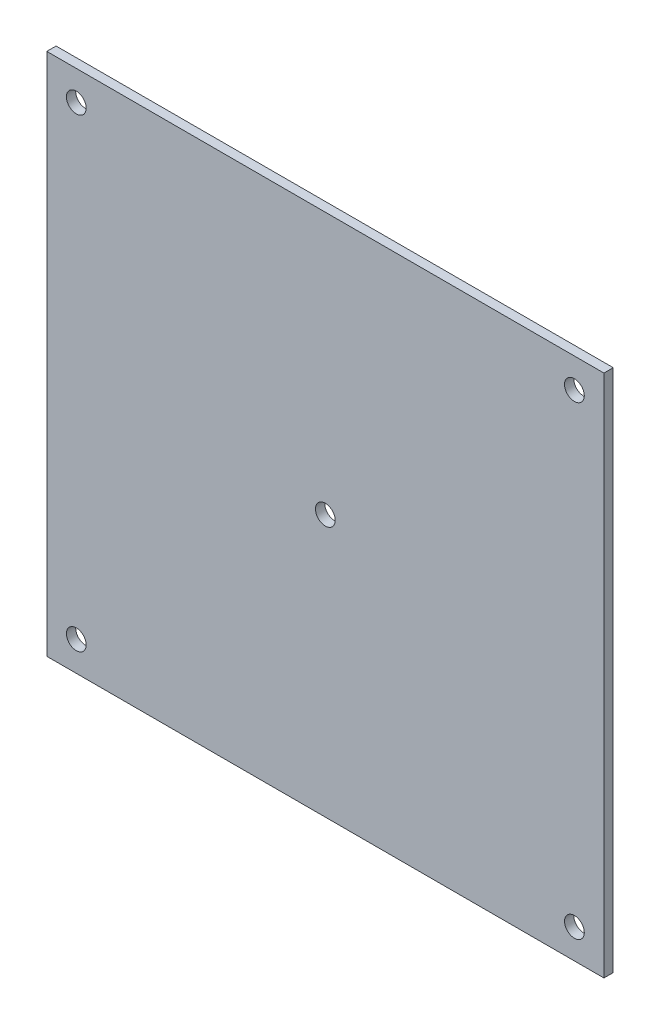
ISO-10303-21;
HEADER;
FILE_DESCRIPTION(('STEP AP214'),'2;1');
FILE_NAME('part.step','',(''),(''),'','','');
FILE_SCHEMA(('AUTOMOTIVE_DESIGN { 1 0 10303 214 1 1 1 1 }'));
ENDSEC;
DATA;
#1=APPLICATION_CONTEXT('core data for automotive mechanical design processes');
#2=APPLICATION_PROTOCOL_DEFINITION('international standard','automotive_design',2000,#1);
#3=PRODUCT_CONTEXT('',#1,'mechanical');
#4=PRODUCT('Part','Part','',(#3));
#5=PRODUCT_RELATED_PRODUCT_CATEGORY('part','',(#4));
#6=PRODUCT_DEFINITION_FORMATION('','',#4);
#7=PRODUCT_DEFINITION_CONTEXT('part definition',#1,'design');
#8=PRODUCT_DEFINITION('design','',#6,#7);
#9=PRODUCT_DEFINITION_SHAPE('','',#8);
#10=(LENGTH_UNIT() NAMED_UNIT(*) SI_UNIT(.MILLI.,.METRE.));
#11=(NAMED_UNIT(*) PLANE_ANGLE_UNIT() SI_UNIT($,.RADIAN.));
#12=(NAMED_UNIT(*) SI_UNIT($,.STERADIAN.) SOLID_ANGLE_UNIT());
#13=UNCERTAINTY_MEASURE_WITH_UNIT(LENGTH_MEASURE(1.E-05),#10,'distance_accuracy_value','');
#14=(GEOMETRIC_REPRESENTATION_CONTEXT(3) GLOBAL_UNCERTAINTY_ASSIGNED_CONTEXT((#13)) GLOBAL_UNIT_ASSIGNED_CONTEXT((#10,
#11,#12)) REPRESENTATION_CONTEXT('',''));
#15=CARTESIAN_POINT('',(0.,0.,0.));
#16=DIRECTION('',(0.,0.,1.));
#17=DIRECTION('',(1.,0.,0.));
#18=AXIS2_PLACEMENT_3D('',#15,#16,#17);
#19=CARTESIAN_POINT('',(0.,0.,1.6));
#20=DIRECTION('',(1.,0.,0.));
#21=DIRECTION('',(0.,0.,-1.));
#22=AXIS2_PLACEMENT_3D('',#19,#20,#21);
#23=PLANE('',#22);
#24=DIRECTION('',(0.,-1.,0.));
#25=VECTOR('',#24,1.);
#26=CARTESIAN_POINT('',(0.,0.,0.));
#27=LINE('',#26,#25);
#28=CARTESIAN_POINT('',(0.,90.17,0.));
#29=VERTEX_POINT('',#28);
#30=CARTESIAN_POINT('',(0.,0.,0.));
#31=VERTEX_POINT('',#30);
#32=EDGE_CURVE('E106',#29,#31,#27,.T.);
#33=ORIENTED_EDGE('',*,*,#32,.T.);
#34=DIRECTION('',(0.,0.,-1.));
#35=VECTOR('',#34,1.);
#36=CARTESIAN_POINT('',(0.,0.,1.6));
#37=LINE('',#36,#35);
#38=CARTESIAN_POINT('',(0.,0.,1.6));
#39=VERTEX_POINT('',#38);
#40=EDGE_CURVE('E11',#39,#31,#37,.T.);
#41=ORIENTED_EDGE('',*,*,#40,.F.);
#42=DIRECTION('',(0.,-1.,0.));
#43=VECTOR('',#42,1.);
#44=CARTESIAN_POINT('',(0.,0.,1.6));
#45=LINE('',#44,#43);
#46=CARTESIAN_POINT('',(0.,90.17,1.6));
#47=VERTEX_POINT('',#46);
#48=EDGE_CURVE('E93',#47,#39,#45,.T.);
#49=ORIENTED_EDGE('',*,*,#48,.F.);
#50=DIRECTION('',(0.,0.,-1.));
#51=VECTOR('',#50,1.);
#52=CARTESIAN_POINT('',(0.,90.17,1.6));
#53=LINE('',#52,#51);
#54=EDGE_CURVE('E102',#47,#29,#53,.T.);
#55=ORIENTED_EDGE('',*,*,#54,.T.);
#56=EDGE_LOOP('',(#33,#41,#49,#55));
#57=FACE_BOUND('',#56,.T.);
#58=ADVANCED_FACE('F40',(#57),#23,.F.);
#59=CARTESIAN_POINT('',(0.,0.,1.6));
#60=DIRECTION('',(0.,1.,0.));
#61=DIRECTION('',(0.,0.,1.));
#62=AXIS2_PLACEMENT_3D('',#59,#60,#61);
#63=PLANE('',#62);
#64=DIRECTION('',(1.,0.,0.));
#65=VECTOR('',#64,1.);
#66=CARTESIAN_POINT('',(0.,0.,0.));
#67=LINE('',#66,#65);
#68=CARTESIAN_POINT('',(95.89,0.,0.));
#69=VERTEX_POINT('',#68);
#70=EDGE_CURVE('E97',#31,#69,#67,.T.);
#71=ORIENTED_EDGE('',*,*,#70,.T.);
#72=DIRECTION('',(0.,0.,-1.));
#73=VECTOR('',#72,1.);
#74=CARTESIAN_POINT('',(95.89,0.,1.6));
#75=LINE('',#74,#73);
#76=CARTESIAN_POINT('',(95.89,0.,1.6));
#77=VERTEX_POINT('',#76);
#78=EDGE_CURVE('E49',#77,#69,#75,.T.);
#79=ORIENTED_EDGE('',*,*,#78,.F.);
#80=DIRECTION('',(1.,0.,0.));
#81=VECTOR('',#80,1.);
#82=CARTESIAN_POINT('',(0.,0.,1.6));
#83=LINE('',#82,#81);
#84=EDGE_CURVE('E88',#39,#77,#83,.T.);
#85=ORIENTED_EDGE('',*,*,#84,.F.);
#86=ORIENTED_EDGE('',*,*,#40,.T.);
#87=EDGE_LOOP('',(#71,#79,#85,#86));
#88=FACE_BOUND('',#87,.T.);
#89=ADVANCED_FACE('F96',(#88),#63,.F.);
#90=CARTESIAN_POINT('',(95.89,0.,1.6));
#91=DIRECTION('',(-1.,0.,0.));
#92=DIRECTION('',(0.,0.,1.));
#93=AXIS2_PLACEMENT_3D('',#90,#91,#92);
#94=PLANE('',#93);
#95=DIRECTION('',(0.,1.,0.));
#96=VECTOR('',#95,1.);
#97=CARTESIAN_POINT('',(95.89,0.,0.));
#98=LINE('',#97,#96);
#99=CARTESIAN_POINT('',(95.89,90.17,0.));
#100=VERTEX_POINT('',#99);
#101=EDGE_CURVE('E75',#69,#100,#98,.T.);
#102=ORIENTED_EDGE('',*,*,#101,.T.);
#103=DIRECTION('',(0.,0.,-1.));
#104=VECTOR('',#103,1.);
#105=CARTESIAN_POINT('',(95.89,90.17,1.6));
#106=LINE('',#105,#104);
#107=CARTESIAN_POINT('',(95.89,90.17,1.6));
#108=VERTEX_POINT('',#107);
#109=EDGE_CURVE('E98',#108,#100,#106,.T.);
#110=ORIENTED_EDGE('',*,*,#109,.F.);
#111=DIRECTION('',(0.,1.,0.));
#112=VECTOR('',#111,1.);
#113=CARTESIAN_POINT('',(95.89,0.,1.6));
#114=LINE('',#113,#112);
#115=EDGE_CURVE('E91',#77,#108,#114,.T.);
#116=ORIENTED_EDGE('',*,*,#115,.F.);
#117=ORIENTED_EDGE('',*,*,#78,.T.);
#118=EDGE_LOOP('',(#102,#110,#116,#117));
#119=FACE_BOUND('',#118,.T.);
#120=ADVANCED_FACE('F100',(#119),#94,.F.);
#121=CARTESIAN_POINT('',(0.,90.17,1.6));
#122=DIRECTION('',(0.,-1.,0.));
#123=DIRECTION('',(0.,0.,-1.));
#124=AXIS2_PLACEMENT_3D('',#121,#122,#123);
#125=PLANE('',#124);
#126=DIRECTION('',(-1.,0.,0.));
#127=VECTOR('',#126,1.);
#128=CARTESIAN_POINT('',(0.,90.17,0.));
#129=LINE('',#128,#127);
#130=EDGE_CURVE('E81',#100,#29,#129,.T.);
#131=ORIENTED_EDGE('',*,*,#130,.T.);
#132=ORIENTED_EDGE('',*,*,#54,.F.);
#133=DIRECTION('',(-1.,0.,0.));
#134=VECTOR('',#133,1.);
#135=CARTESIAN_POINT('',(0.,90.17,1.6));
#136=LINE('',#135,#134);
#137=EDGE_CURVE('E58',#108,#47,#136,.T.);
#138=ORIENTED_EDGE('',*,*,#137,.F.);
#139=ORIENTED_EDGE('',*,*,#109,.T.);
#140=EDGE_LOOP('',(#131,#132,#138,#139));
#141=FACE_BOUND('',#140,.T.);
#142=ADVANCED_FACE('F147',(#141),#125,.F.);
#143=CARTESIAN_POINT('',(0.,0.,1.6));
#144=DIRECTION('',(0.,0.,-1.));
#145=DIRECTION('',(-1.,0.,0.));
#146=AXIS2_PLACEMENT_3D('',#143,#144,#145);
#147=PLANE('',#146);
#148=CARTESIAN_POINT('',(90.81,5.08,1.6));
#149=DIRECTION('',(0.,0.,1.));
#150=DIRECTION('',(1.,0.,0.));
#151=AXIS2_PLACEMENT_3D('',#148,#149,#150);
#152=CIRCLE('',#151,1.69999999999999);
#153=CARTESIAN_POINT('',(92.51,5.08,1.6));
#154=VERTEX_POINT('',#153);
#155=EDGE_CURVE('E239',#154,#154,#152,.T.);
#156=ORIENTED_EDGE('',*,*,#155,.F.);
#157=EDGE_LOOP('',(#156));
#158=FACE_BOUND('',#157,.T.);
#159=CARTESIAN_POINT('',(5.08,85.09,1.6));
#160=DIRECTION('',(0.,0.,1.));
#161=DIRECTION('',(1.,0.,0.));
#162=AXIS2_PLACEMENT_3D('',#159,#160,#161);
#163=CIRCLE('',#162,1.7);
#164=CARTESIAN_POINT('',(6.78,85.09,1.6));
#165=VERTEX_POINT('',#164);
#166=EDGE_CURVE('E237',#165,#165,#163,.T.);
#167=ORIENTED_EDGE('',*,*,#166,.F.);
#168=EDGE_LOOP('',(#167));
#169=FACE_BOUND('',#168,.T.);
#170=CARTESIAN_POINT('',(90.81,85.09,1.6));
#171=DIRECTION('',(0.,0.,1.));
#172=DIRECTION('',(1.,0.,0.));
#173=AXIS2_PLACEMENT_3D('',#170,#171,#172);
#174=CIRCLE('',#173,1.69999999999999);
#175=CARTESIAN_POINT('',(92.51,85.09,1.6));
#176=VERTEX_POINT('',#175);
#177=EDGE_CURVE('E240',#176,#176,#174,.T.);
#178=ORIENTED_EDGE('',*,*,#177,.F.);
#179=EDGE_LOOP('',(#178));
#180=FACE_BOUND('',#179,.T.);
#181=CARTESIAN_POINT('',(47.945,45.085,1.6));
#182=DIRECTION('',(0.,0.,1.));
#183=DIRECTION('',(1.,0.,0.));
#184=AXIS2_PLACEMENT_3D('',#181,#182,#183);
#185=CIRCLE('',#184,1.7);
#186=CARTESIAN_POINT('',(49.645,45.085,1.6));
#187=VERTEX_POINT('',#186);
#188=EDGE_CURVE('E245',#187,#187,#185,.T.);
#189=ORIENTED_EDGE('',*,*,#188,.F.);
#190=EDGE_LOOP('',(#189));
#191=FACE_BOUND('',#190,.T.);
#192=CARTESIAN_POINT('',(5.08,5.08,1.6));
#193=DIRECTION('',(0.,0.,1.));
#194=DIRECTION('',(1.,0.,0.));
#195=AXIS2_PLACEMENT_3D('',#192,#193,#194);
#196=CIRCLE('',#195,1.7);
#197=CARTESIAN_POINT('',(6.78,5.08,1.6));
#198=VERTEX_POINT('',#197);
#199=EDGE_CURVE('E118',#198,#198,#196,.T.);
#200=ORIENTED_EDGE('',*,*,#199,.F.);
#201=EDGE_LOOP('',(#200));
#202=FACE_BOUND('',#201,.T.);
#203=ORIENTED_EDGE('',*,*,#48,.T.);
#204=ORIENTED_EDGE('',*,*,#84,.T.);
#205=ORIENTED_EDGE('',*,*,#115,.T.);
#206=ORIENTED_EDGE('',*,*,#137,.T.);
#207=EDGE_LOOP('',(#203,#204,#205,#206));
#208=FACE_BOUND('',#207,.T.);
#209=ADVANCED_FACE('F89',(#158,#169,#180,#191,#202,#208),#147,.F.);
#210=CARTESIAN_POINT('',(0.,0.,0.));
#211=DIRECTION('',(0.,0.,-1.));
#212=DIRECTION('',(-1.,0.,0.));
#213=AXIS2_PLACEMENT_3D('',#210,#211,#212);
#214=PLANE('',#213);
#215=CARTESIAN_POINT('',(90.81,5.08,0.));
#216=DIRECTION('',(0.,0.,-1.));
#217=DIRECTION('',(-1.,0.,0.));
#218=AXIS2_PLACEMENT_3D('',#215,#216,#217);
#219=CIRCLE('',#218,1.69999999999999);
#220=CARTESIAN_POINT('',(92.51,5.08,0.));
#221=VERTEX_POINT('',#220);
#222=EDGE_CURVE('E43',#221,#221,#219,.T.);
#223=ORIENTED_EDGE('',*,*,#222,.F.);
#224=EDGE_LOOP('',(#223));
#225=FACE_BOUND('',#224,.T.);
#226=CARTESIAN_POINT('',(5.08,85.09,0.));
#227=DIRECTION('',(0.,0.,-1.));
#228=DIRECTION('',(-1.,0.,0.));
#229=AXIS2_PLACEMENT_3D('',#226,#227,#228);
#230=CIRCLE('',#229,1.7);
#231=CARTESIAN_POINT('',(6.78,85.09,0.));
#232=VERTEX_POINT('',#231);
#233=EDGE_CURVE('E123',#232,#232,#230,.T.);
#234=ORIENTED_EDGE('',*,*,#233,.F.);
#235=EDGE_LOOP('',(#234));
#236=FACE_BOUND('',#235,.T.);
#237=CARTESIAN_POINT('',(90.81,85.09,0.));
#238=DIRECTION('',(0.,0.,-1.));
#239=DIRECTION('',(-1.,0.,0.));
#240=AXIS2_PLACEMENT_3D('',#237,#238,#239);
#241=CIRCLE('',#240,1.69999999999999);
#242=CARTESIAN_POINT('',(92.51,85.09,0.));
#243=VERTEX_POINT('',#242);
#244=EDGE_CURVE('E121',#243,#243,#241,.T.);
#245=ORIENTED_EDGE('',*,*,#244,.F.);
#246=EDGE_LOOP('',(#245));
#247=FACE_BOUND('',#246,.T.);
#248=CARTESIAN_POINT('',(47.945,45.085,0.));
#249=DIRECTION('',(0.,0.,-1.));
#250=DIRECTION('',(-1.,0.,0.));
#251=AXIS2_PLACEMENT_3D('',#248,#249,#250);
#252=CIRCLE('',#251,1.7);
#253=CARTESIAN_POINT('',(49.645,45.085,0.));
#254=VERTEX_POINT('',#253);
#255=EDGE_CURVE('E117',#254,#254,#252,.T.);
#256=ORIENTED_EDGE('',*,*,#255,.F.);
#257=EDGE_LOOP('',(#256));
#258=FACE_BOUND('',#257,.T.);
#259=CARTESIAN_POINT('',(5.08,5.08,0.));
#260=DIRECTION('',(0.,0.,-1.));
#261=DIRECTION('',(-1.,0.,0.));
#262=AXIS2_PLACEMENT_3D('',#259,#260,#261);
#263=CIRCLE('',#262,1.7);
#264=CARTESIAN_POINT('',(6.78,5.08,0.));
#265=VERTEX_POINT('',#264);
#266=EDGE_CURVE('E114',#265,#265,#263,.T.);
#267=ORIENTED_EDGE('',*,*,#266,.F.);
#268=EDGE_LOOP('',(#267));
#269=FACE_BOUND('',#268,.T.);
#270=ORIENTED_EDGE('',*,*,#32,.F.);
#271=ORIENTED_EDGE('',*,*,#130,.F.);
#272=ORIENTED_EDGE('',*,*,#101,.F.);
#273=ORIENTED_EDGE('',*,*,#70,.F.);
#274=EDGE_LOOP('',(#270,#271,#272,#273));
#275=FACE_BOUND('',#274,.T.);
#276=ADVANCED_FACE('F133',(#225,#236,#247,#258,#269,#275),#214,.T.);
#277=CARTESIAN_POINT('',(5.08,5.08,-1.2E-05));
#278=DIRECTION('',(0.,0.,1.));
#279=DIRECTION('',(1.,0.,0.));
#280=AXIS2_PLACEMENT_3D('',#277,#278,#279);
#281=CYLINDRICAL_SURFACE('',#280,1.7);
#282=CARTESIAN_POINT('',(6.78,5.08,0.));
#283=CARTESIAN_POINT('',(6.78,5.08,0.0166666666666667));
#284=CARTESIAN_POINT('',(6.78,5.08,0.0333333333333333));
#285=CARTESIAN_POINT('',(6.78,5.08,0.0666666666666667));
#286=CARTESIAN_POINT('',(6.78,5.08,0.0833333333333333));
#287=CARTESIAN_POINT('',(6.78,5.08,0.116666666666667));
#288=CARTESIAN_POINT('',(6.78,5.08,0.133333333333333));
#289=CARTESIAN_POINT('',(6.78,5.08,0.166666666666667));
#290=CARTESIAN_POINT('',(6.78,5.08,0.183333333333333));
#291=CARTESIAN_POINT('',(6.78,5.08,0.216666666666667));
#292=CARTESIAN_POINT('',(6.78,5.08,0.233333333333333));
#293=CARTESIAN_POINT('',(6.78,5.08,0.266666666666667));
#294=CARTESIAN_POINT('',(6.78,5.08,0.283333333333333));
#295=CARTESIAN_POINT('',(6.78,5.08,0.316666666666667));
#296=CARTESIAN_POINT('',(6.78,5.08,0.333333333333333));
#297=CARTESIAN_POINT('',(6.78,5.08,0.366666666666667));
#298=CARTESIAN_POINT('',(6.78,5.08,0.383333333333333));
#299=CARTESIAN_POINT('',(6.78,5.08,0.416666666666667));
#300=CARTESIAN_POINT('',(6.78,5.08,0.433333333333333));
#301=CARTESIAN_POINT('',(6.78,5.08,0.466666666666667));
#302=CARTESIAN_POINT('',(6.78,5.08,0.483333333333333));
#303=CARTESIAN_POINT('',(6.78,5.08,0.516666666666667));
#304=CARTESIAN_POINT('',(6.78,5.08,0.533333333333333));
#305=CARTESIAN_POINT('',(6.78,5.08,0.566666666666667));
#306=CARTESIAN_POINT('',(6.78,5.08,0.583333333333333));
#307=CARTESIAN_POINT('',(6.78,5.08,0.616666666666667));
#308=CARTESIAN_POINT('',(6.78,5.08,0.633333333333333));
#309=CARTESIAN_POINT('',(6.78,5.08,0.666666666666667));
#310=CARTESIAN_POINT('',(6.78,5.08,0.683333333333333));
#311=CARTESIAN_POINT('',(6.78,5.08,0.716666666666667));
#312=CARTESIAN_POINT('',(6.78,5.08,0.733333333333333));
#313=CARTESIAN_POINT('',(6.78,5.08,0.766666666666667));
#314=CARTESIAN_POINT('',(6.78,5.08,0.783333333333333));
#315=CARTESIAN_POINT('',(6.78,5.08,0.816666666666667));
#316=CARTESIAN_POINT('',(6.78,5.08,0.833333333333333));
#317=CARTESIAN_POINT('',(6.78,5.08,0.866666666666667));
#318=CARTESIAN_POINT('',(6.78,5.08,0.883333333333333));
#319=CARTESIAN_POINT('',(6.78,5.08,0.916666666666667));
#320=CARTESIAN_POINT('',(6.78,5.08,0.933333333333333));
#321=CARTESIAN_POINT('',(6.78,5.08,0.966666666666667));
#322=CARTESIAN_POINT('',(6.78,5.08,0.983333333333333));
#323=CARTESIAN_POINT('',(6.78,5.08,1.01666666666667));
#324=CARTESIAN_POINT('',(6.78,5.08,1.03333333333333));
#325=CARTESIAN_POINT('',(6.78,5.08,1.06666666666667));
#326=CARTESIAN_POINT('',(6.78,5.08,1.08333333333333));
#327=CARTESIAN_POINT('',(6.78,5.08,1.11666666666667));
#328=CARTESIAN_POINT('',(6.78,5.08,1.13333333333333));
#329=CARTESIAN_POINT('',(6.78,5.08,1.16666666666667));
#330=CARTESIAN_POINT('',(6.78,5.08,1.18333333333333));
#331=CARTESIAN_POINT('',(6.78,5.08,1.21666666666667));
#332=CARTESIAN_POINT('',(6.78,5.08,1.23333333333333));
#333=CARTESIAN_POINT('',(6.78,5.08,1.26666666666667));
#334=CARTESIAN_POINT('',(6.78,5.08,1.28333333333333));
#335=CARTESIAN_POINT('',(6.78,5.08,1.31666666666667));
#336=CARTESIAN_POINT('',(6.78,5.08,1.33333333333333));
#337=CARTESIAN_POINT('',(6.78,5.08,1.36666666666667));
#338=CARTESIAN_POINT('',(6.78,5.08,1.38333333333333));
#339=CARTESIAN_POINT('',(6.78,5.08,1.41666666666667));
#340=CARTESIAN_POINT('',(6.78,5.08,1.43333333333333));
#341=CARTESIAN_POINT('',(6.78,5.08,1.46666666666667));
#342=CARTESIAN_POINT('',(6.78,5.08,1.48333333333333));
#343=CARTESIAN_POINT('',(6.78,5.08,1.51666666666667));
#344=CARTESIAN_POINT('',(6.78,5.08,1.53333333333333));
#345=CARTESIAN_POINT('',(6.78,5.08,1.56666666666667));
#346=CARTESIAN_POINT('',(6.78,5.08,1.58333333333333));
#347=CARTESIAN_POINT('',(6.78,5.08,1.6));
#348=B_SPLINE_CURVE_WITH_KNOTS('',3,(#282,#283,#284,#285,#286,#287,#288,#289,#290,#291,#292,
#293,#294,#295,#296,#297,#298,#299,#300,#301,#302,#303,#304,#305,#306,#307,#308,#309,#310,#311,
#312,#313,#314,#315,#316,#317,#318,#319,#320,#321,#322,#323,#324,#325,#326,#327,#328,#329,#330,
#331,#332,#333,#334,#335,#336,#337,#338,#339,#340,#341,#342,#343,#344,#345,#346,#347),
.UNSPECIFIED.,.F.,.F.,(4,2,2,2,2,2,2,2,2,2,2,2,2,2,2,2,2,2,2,2,2,2,2,2,2,2,2,2,2,2,2,2,4),(0.,
0.05,0.1,0.15,0.2,0.25,0.3,0.35,0.4,0.45,0.5,0.55,0.6,0.65,0.7,0.75,0.8,0.85,0.9,0.95,1.,1.05,
1.1,1.15,1.2,1.25,1.3,1.35,1.4,1.45,1.5,1.55,1.6),.UNSPECIFIED.);
#349=EDGE_CURVE('BSEAM136',#265,#198,#348,.T.);
#350=ORIENTED_EDGE('',*,*,#266,.T.);
#351=ORIENTED_EDGE('',*,*,#199,.T.);
#352=ORIENTED_EDGE('',*,*,#349,.T.);
#353=ORIENTED_EDGE('',*,*,#349,.F.);
#354=EDGE_LOOP('',(#350,#352,#351,#353));
#355=FACE_BOUND('',#354,.T.);
#356=ADVANCED_FACE('F136',(#355),#281,.F.);
#357=CARTESIAN_POINT('',(47.945,45.085,-1.2E-05));
#358=DIRECTION('',(0.,0.,1.));
#359=DIRECTION('',(1.,0.,0.));
#360=AXIS2_PLACEMENT_3D('',#357,#358,#359);
#361=CYLINDRICAL_SURFACE('',#360,1.7);
#362=CARTESIAN_POINT('',(49.645,45.085,0.));
#363=CARTESIAN_POINT('',(49.645,45.085,0.0166666666666667));
#364=CARTESIAN_POINT('',(49.645,45.085,0.0333333333333333));
#365=CARTESIAN_POINT('',(49.645,45.085,0.0666666666666667));
#366=CARTESIAN_POINT('',(49.645,45.085,0.0833333333333333));
#367=CARTESIAN_POINT('',(49.645,45.085,0.116666666666667));
#368=CARTESIAN_POINT('',(49.645,45.085,0.133333333333333));
#369=CARTESIAN_POINT('',(49.645,45.085,0.166666666666667));
#370=CARTESIAN_POINT('',(49.645,45.085,0.183333333333333));
#371=CARTESIAN_POINT('',(49.645,45.085,0.216666666666667));
#372=CARTESIAN_POINT('',(49.645,45.085,0.233333333333333));
#373=CARTESIAN_POINT('',(49.645,45.085,0.266666666666667));
#374=CARTESIAN_POINT('',(49.645,45.085,0.283333333333333));
#375=CARTESIAN_POINT('',(49.645,45.085,0.316666666666667));
#376=CARTESIAN_POINT('',(49.645,45.085,0.333333333333333));
#377=CARTESIAN_POINT('',(49.645,45.085,0.366666666666667));
#378=CARTESIAN_POINT('',(49.645,45.085,0.383333333333333));
#379=CARTESIAN_POINT('',(49.645,45.085,0.416666666666667));
#380=CARTESIAN_POINT('',(49.645,45.085,0.433333333333333));
#381=CARTESIAN_POINT('',(49.645,45.085,0.466666666666667));
#382=CARTESIAN_POINT('',(49.645,45.085,0.483333333333333));
#383=CARTESIAN_POINT('',(49.645,45.085,0.516666666666667));
#384=CARTESIAN_POINT('',(49.645,45.085,0.533333333333333));
#385=CARTESIAN_POINT('',(49.645,45.085,0.566666666666667));
#386=CARTESIAN_POINT('',(49.645,45.085,0.583333333333333));
#387=CARTESIAN_POINT('',(49.645,45.085,0.616666666666667));
#388=CARTESIAN_POINT('',(49.645,45.085,0.633333333333333));
#389=CARTESIAN_POINT('',(49.645,45.085,0.666666666666667));
#390=CARTESIAN_POINT('',(49.645,45.085,0.683333333333333));
#391=CARTESIAN_POINT('',(49.645,45.085,0.716666666666667));
#392=CARTESIAN_POINT('',(49.645,45.085,0.733333333333333));
#393=CARTESIAN_POINT('',(49.645,45.085,0.766666666666667));
#394=CARTESIAN_POINT('',(49.645,45.085,0.783333333333333));
#395=CARTESIAN_POINT('',(49.645,45.085,0.816666666666667));
#396=CARTESIAN_POINT('',(49.645,45.085,0.833333333333333));
#397=CARTESIAN_POINT('',(49.645,45.085,0.866666666666667));
#398=CARTESIAN_POINT('',(49.645,45.085,0.883333333333333));
#399=CARTESIAN_POINT('',(49.645,45.085,0.916666666666667));
#400=CARTESIAN_POINT('',(49.645,45.085,0.933333333333333));
#401=CARTESIAN_POINT('',(49.645,45.085,0.966666666666667));
#402=CARTESIAN_POINT('',(49.645,45.085,0.983333333333333));
#403=CARTESIAN_POINT('',(49.645,45.085,1.01666666666667));
#404=CARTESIAN_POINT('',(49.645,45.085,1.03333333333333));
#405=CARTESIAN_POINT('',(49.645,45.085,1.06666666666667));
#406=CARTESIAN_POINT('',(49.645,45.085,1.08333333333333));
#407=CARTESIAN_POINT('',(49.645,45.085,1.11666666666667));
#408=CARTESIAN_POINT('',(49.645,45.085,1.13333333333333));
#409=CARTESIAN_POINT('',(49.645,45.085,1.16666666666667));
#410=CARTESIAN_POINT('',(49.645,45.085,1.18333333333333));
#411=CARTESIAN_POINT('',(49.645,45.085,1.21666666666667));
#412=CARTESIAN_POINT('',(49.645,45.085,1.23333333333333));
#413=CARTESIAN_POINT('',(49.645,45.085,1.26666666666667));
#414=CARTESIAN_POINT('',(49.645,45.085,1.28333333333333));
#415=CARTESIAN_POINT('',(49.645,45.085,1.31666666666667));
#416=CARTESIAN_POINT('',(49.645,45.085,1.33333333333333));
#417=CARTESIAN_POINT('',(49.645,45.085,1.36666666666667));
#418=CARTESIAN_POINT('',(49.645,45.085,1.38333333333333));
#419=CARTESIAN_POINT('',(49.645,45.085,1.41666666666667));
#420=CARTESIAN_POINT('',(49.645,45.085,1.43333333333333));
#421=CARTESIAN_POINT('',(49.645,45.085,1.46666666666667));
#422=CARTESIAN_POINT('',(49.645,45.085,1.48333333333333));
#423=CARTESIAN_POINT('',(49.645,45.085,1.51666666666667));
#424=CARTESIAN_POINT('',(49.645,45.085,1.53333333333333));
#425=CARTESIAN_POINT('',(49.645,45.085,1.56666666666667));
#426=CARTESIAN_POINT('',(49.645,45.085,1.58333333333333));
#427=CARTESIAN_POINT('',(49.645,45.085,1.6));
#428=B_SPLINE_CURVE_WITH_KNOTS('',3,(#362,#363,#364,#365,#366,#367,#368,#369,#370,#371,#372,
#373,#374,#375,#376,#377,#378,#379,#380,#381,#382,#383,#384,#385,#386,#387,#388,#389,#390,#391,
#392,#393,#394,#395,#396,#397,#398,#399,#400,#401,#402,#403,#404,#405,#406,#407,#408,#409,#410,
#411,#412,#413,#414,#415,#416,#417,#418,#419,#420,#421,#422,#423,#424,#425,#426,#427),
.UNSPECIFIED.,.F.,.F.,(4,2,2,2,2,2,2,2,2,2,2,2,2,2,2,2,2,2,2,2,2,2,2,2,2,2,2,2,2,2,2,2,4),(0.,
0.05,0.1,0.15,0.2,0.25,0.3,0.35,0.4,0.45,0.5,0.55,0.6,0.65,0.7,0.75,0.8,0.85,0.9,0.95,1.,1.05,
1.1,1.15,1.2,1.25,1.3,1.35,1.4,1.45,1.5,1.55,1.6),.UNSPECIFIED.);
#429=EDGE_CURVE('BSEAM194',#254,#187,#428,.T.);
#430=ORIENTED_EDGE('',*,*,#255,.T.);
#431=ORIENTED_EDGE('',*,*,#188,.T.);
#432=ORIENTED_EDGE('',*,*,#429,.T.);
#433=ORIENTED_EDGE('',*,*,#429,.F.);
#434=EDGE_LOOP('',(#430,#432,#431,#433));
#435=FACE_BOUND('',#434,.T.);
#436=ADVANCED_FACE('F194',(#435),#361,.F.);
#437=CARTESIAN_POINT('',(90.81,85.09,-1.2E-05));
#438=DIRECTION('',(0.,0.,1.));
#439=DIRECTION('',(1.,0.,0.));
#440=AXIS2_PLACEMENT_3D('',#437,#438,#439);
#441=CYLINDRICAL_SURFACE('',#440,1.69999999999999);
#442=CARTESIAN_POINT('',(92.51,85.09,0.));
#443=CARTESIAN_POINT('',(92.51,85.09,0.0166666666666667));
#444=CARTESIAN_POINT('',(92.51,85.09,0.0333333333333333));
#445=CARTESIAN_POINT('',(92.51,85.09,0.0666666666666667));
#446=CARTESIAN_POINT('',(92.51,85.09,0.0833333333333333));
#447=CARTESIAN_POINT('',(92.51,85.09,0.116666666666667));
#448=CARTESIAN_POINT('',(92.51,85.09,0.133333333333333));
#449=CARTESIAN_POINT('',(92.51,85.09,0.166666666666667));
#450=CARTESIAN_POINT('',(92.51,85.09,0.183333333333333));
#451=CARTESIAN_POINT('',(92.51,85.09,0.216666666666667));
#452=CARTESIAN_POINT('',(92.51,85.09,0.233333333333333));
#453=CARTESIAN_POINT('',(92.51,85.09,0.266666666666667));
#454=CARTESIAN_POINT('',(92.51,85.09,0.283333333333333));
#455=CARTESIAN_POINT('',(92.51,85.09,0.316666666666667));
#456=CARTESIAN_POINT('',(92.51,85.09,0.333333333333333));
#457=CARTESIAN_POINT('',(92.51,85.09,0.366666666666667));
#458=CARTESIAN_POINT('',(92.51,85.09,0.383333333333333));
#459=CARTESIAN_POINT('',(92.51,85.09,0.416666666666667));
#460=CARTESIAN_POINT('',(92.51,85.09,0.433333333333333));
#461=CARTESIAN_POINT('',(92.51,85.09,0.466666666666667));
#462=CARTESIAN_POINT('',(92.51,85.09,0.483333333333333));
#463=CARTESIAN_POINT('',(92.51,85.09,0.516666666666667));
#464=CARTESIAN_POINT('',(92.51,85.09,0.533333333333333));
#465=CARTESIAN_POINT('',(92.51,85.09,0.566666666666667));
#466=CARTESIAN_POINT('',(92.51,85.09,0.583333333333333));
#467=CARTESIAN_POINT('',(92.51,85.09,0.616666666666667));
#468=CARTESIAN_POINT('',(92.51,85.09,0.633333333333333));
#469=CARTESIAN_POINT('',(92.51,85.09,0.666666666666667));
#470=CARTESIAN_POINT('',(92.51,85.09,0.683333333333333));
#471=CARTESIAN_POINT('',(92.51,85.09,0.716666666666667));
#472=CARTESIAN_POINT('',(92.51,85.09,0.733333333333333));
#473=CARTESIAN_POINT('',(92.51,85.09,0.766666666666667));
#474=CARTESIAN_POINT('',(92.51,85.09,0.783333333333333));
#475=CARTESIAN_POINT('',(92.51,85.09,0.816666666666667));
#476=CARTESIAN_POINT('',(92.51,85.09,0.833333333333333));
#477=CARTESIAN_POINT('',(92.51,85.09,0.866666666666667));
#478=CARTESIAN_POINT('',(92.51,85.09,0.883333333333333));
#479=CARTESIAN_POINT('',(92.51,85.09,0.916666666666667));
#480=CARTESIAN_POINT('',(92.51,85.09,0.933333333333333));
#481=CARTESIAN_POINT('',(92.51,85.09,0.966666666666667));
#482=CARTESIAN_POINT('',(92.51,85.09,0.983333333333333));
#483=CARTESIAN_POINT('',(92.51,85.09,1.01666666666667));
#484=CARTESIAN_POINT('',(92.51,85.09,1.03333333333333));
#485=CARTESIAN_POINT('',(92.51,85.09,1.06666666666667));
#486=CARTESIAN_POINT('',(92.51,85.09,1.08333333333333));
#487=CARTESIAN_POINT('',(92.51,85.09,1.11666666666667));
#488=CARTESIAN_POINT('',(92.51,85.09,1.13333333333333));
#489=CARTESIAN_POINT('',(92.51,85.09,1.16666666666667));
#490=CARTESIAN_POINT('',(92.51,85.09,1.18333333333333));
#491=CARTESIAN_POINT('',(92.51,85.09,1.21666666666667));
#492=CARTESIAN_POINT('',(92.51,85.09,1.23333333333333));
#493=CARTESIAN_POINT('',(92.51,85.09,1.26666666666667));
#494=CARTESIAN_POINT('',(92.51,85.09,1.28333333333333));
#495=CARTESIAN_POINT('',(92.51,85.09,1.31666666666667));
#496=CARTESIAN_POINT('',(92.51,85.09,1.33333333333333));
#497=CARTESIAN_POINT('',(92.51,85.09,1.36666666666667));
#498=CARTESIAN_POINT('',(92.51,85.09,1.38333333333333));
#499=CARTESIAN_POINT('',(92.51,85.09,1.41666666666667));
#500=CARTESIAN_POINT('',(92.51,85.09,1.43333333333333));
#501=CARTESIAN_POINT('',(92.51,85.09,1.46666666666667));
#502=CARTESIAN_POINT('',(92.51,85.09,1.48333333333333));
#503=CARTESIAN_POINT('',(92.51,85.09,1.51666666666667));
#504=CARTESIAN_POINT('',(92.51,85.09,1.53333333333333));
#505=CARTESIAN_POINT('',(92.51,85.09,1.56666666666667));
#506=CARTESIAN_POINT('',(92.51,85.09,1.58333333333333));
#507=CARTESIAN_POINT('',(92.51,85.09,1.6));
#508=B_SPLINE_CURVE_WITH_KNOTS('',3,(#442,#443,#444,#445,#446,#447,#448,#449,#450,#451,#452,
#453,#454,#455,#456,#457,#458,#459,#460,#461,#462,#463,#464,#465,#466,#467,#468,#469,#470,#471,
#472,#473,#474,#475,#476,#477,#478,#479,#480,#481,#482,#483,#484,#485,#486,#487,#488,#489,#490,
#491,#492,#493,#494,#495,#496,#497,#498,#499,#500,#501,#502,#503,#504,#505,#506,#507),
.UNSPECIFIED.,.F.,.F.,(4,2,2,2,2,2,2,2,2,2,2,2,2,2,2,2,2,2,2,2,2,2,2,2,2,2,2,2,2,2,2,2,4),(0.,
0.05,0.1,0.15,0.2,0.25,0.3,0.35,0.4,0.45,0.5,0.55,0.6,0.65,0.7,0.75,0.8,0.85,0.9,0.95,1.,1.05,
1.1,1.15,1.2,1.25,1.3,1.35,1.4,1.45,1.5,1.55,1.6),.UNSPECIFIED.);
#509=EDGE_CURVE('BSEAM204',#243,#176,#508,.T.);
#510=ORIENTED_EDGE('',*,*,#244,.T.);
#511=ORIENTED_EDGE('',*,*,#177,.T.);
#512=ORIENTED_EDGE('',*,*,#509,.T.);
#513=ORIENTED_EDGE('',*,*,#509,.F.);
#514=EDGE_LOOP('',(#510,#512,#511,#513));
#515=FACE_BOUND('',#514,.T.);
#516=ADVANCED_FACE('F204',(#515),#441,.F.);
#517=CARTESIAN_POINT('',(5.08,85.09,-1.2E-05));
#518=DIRECTION('',(0.,0.,1.));
#519=DIRECTION('',(1.,0.,0.));
#520=AXIS2_PLACEMENT_3D('',#517,#518,#519);
#521=CYLINDRICAL_SURFACE('',#520,1.7);
#522=CARTESIAN_POINT('',(6.78,85.09,0.));
#523=CARTESIAN_POINT('',(6.78,85.09,0.0166666666666667));
#524=CARTESIAN_POINT('',(6.78,85.09,0.0333333333333333));
#525=CARTESIAN_POINT('',(6.78,85.09,0.0666666666666667));
#526=CARTESIAN_POINT('',(6.78,85.09,0.0833333333333333));
#527=CARTESIAN_POINT('',(6.78,85.09,0.116666666666667));
#528=CARTESIAN_POINT('',(6.78,85.09,0.133333333333333));
#529=CARTESIAN_POINT('',(6.78,85.09,0.166666666666667));
#530=CARTESIAN_POINT('',(6.78,85.09,0.183333333333333));
#531=CARTESIAN_POINT('',(6.78,85.09,0.216666666666667));
#532=CARTESIAN_POINT('',(6.78,85.09,0.233333333333333));
#533=CARTESIAN_POINT('',(6.78,85.09,0.266666666666667));
#534=CARTESIAN_POINT('',(6.78,85.09,0.283333333333333));
#535=CARTESIAN_POINT('',(6.78,85.09,0.316666666666667));
#536=CARTESIAN_POINT('',(6.78,85.09,0.333333333333333));
#537=CARTESIAN_POINT('',(6.78,85.09,0.366666666666667));
#538=CARTESIAN_POINT('',(6.78,85.09,0.383333333333333));
#539=CARTESIAN_POINT('',(6.78,85.09,0.416666666666667));
#540=CARTESIAN_POINT('',(6.78,85.09,0.433333333333333));
#541=CARTESIAN_POINT('',(6.78,85.09,0.466666666666667));
#542=CARTESIAN_POINT('',(6.78,85.09,0.483333333333333));
#543=CARTESIAN_POINT('',(6.78,85.09,0.516666666666667));
#544=CARTESIAN_POINT('',(6.78,85.09,0.533333333333333));
#545=CARTESIAN_POINT('',(6.78,85.09,0.566666666666667));
#546=CARTESIAN_POINT('',(6.78,85.09,0.583333333333333));
#547=CARTESIAN_POINT('',(6.78,85.09,0.616666666666667));
#548=CARTESIAN_POINT('',(6.78,85.09,0.633333333333333));
#549=CARTESIAN_POINT('',(6.78,85.09,0.666666666666667));
#550=CARTESIAN_POINT('',(6.78,85.09,0.683333333333333));
#551=CARTESIAN_POINT('',(6.78,85.09,0.716666666666667));
#552=CARTESIAN_POINT('',(6.78,85.09,0.733333333333333));
#553=CARTESIAN_POINT('',(6.78,85.09,0.766666666666667));
#554=CARTESIAN_POINT('',(6.78,85.09,0.783333333333333));
#555=CARTESIAN_POINT('',(6.78,85.09,0.816666666666667));
#556=CARTESIAN_POINT('',(6.78,85.09,0.833333333333333));
#557=CARTESIAN_POINT('',(6.78,85.09,0.866666666666667));
#558=CARTESIAN_POINT('',(6.78,85.09,0.883333333333333));
#559=CARTESIAN_POINT('',(6.78,85.09,0.916666666666667));
#560=CARTESIAN_POINT('',(6.78,85.09,0.933333333333333));
#561=CARTESIAN_POINT('',(6.78,85.09,0.966666666666667));
#562=CARTESIAN_POINT('',(6.78,85.09,0.983333333333333));
#563=CARTESIAN_POINT('',(6.78,85.09,1.01666666666667));
#564=CARTESIAN_POINT('',(6.78,85.09,1.03333333333333));
#565=CARTESIAN_POINT('',(6.78,85.09,1.06666666666667));
#566=CARTESIAN_POINT('',(6.78,85.09,1.08333333333333));
#567=CARTESIAN_POINT('',(6.78,85.09,1.11666666666667));
#568=CARTESIAN_POINT('',(6.78,85.09,1.13333333333333));
#569=CARTESIAN_POINT('',(6.78,85.09,1.16666666666667));
#570=CARTESIAN_POINT('',(6.78,85.09,1.18333333333333));
#571=CARTESIAN_POINT('',(6.78,85.09,1.21666666666667));
#572=CARTESIAN_POINT('',(6.78,85.09,1.23333333333333));
#573=CARTESIAN_POINT('',(6.78,85.09,1.26666666666667));
#574=CARTESIAN_POINT('',(6.78,85.09,1.28333333333333));
#575=CARTESIAN_POINT('',(6.78,85.09,1.31666666666667));
#576=CARTESIAN_POINT('',(6.78,85.09,1.33333333333333));
#577=CARTESIAN_POINT('',(6.78,85.09,1.36666666666667));
#578=CARTESIAN_POINT('',(6.78,85.09,1.38333333333333));
#579=CARTESIAN_POINT('',(6.78,85.09,1.41666666666667));
#580=CARTESIAN_POINT('',(6.78,85.09,1.43333333333333));
#581=CARTESIAN_POINT('',(6.78,85.09,1.46666666666667));
#582=CARTESIAN_POINT('',(6.78,85.09,1.48333333333333));
#583=CARTESIAN_POINT('',(6.78,85.09,1.51666666666667));
#584=CARTESIAN_POINT('',(6.78,85.09,1.53333333333333));
#585=CARTESIAN_POINT('',(6.78,85.09,1.56666666666667));
#586=CARTESIAN_POINT('',(6.78,85.09,1.58333333333333));
#587=CARTESIAN_POINT('',(6.78,85.09,1.6));
#588=B_SPLINE_CURVE_WITH_KNOTS('',3,(#522,#523,#524,#525,#526,#527,#528,#529,#530,#531,#532,
#533,#534,#535,#536,#537,#538,#539,#540,#541,#542,#543,#544,#545,#546,#547,#548,#549,#550,#551,
#552,#553,#554,#555,#556,#557,#558,#559,#560,#561,#562,#563,#564,#565,#566,#567,#568,#569,#570,
#571,#572,#573,#574,#575,#576,#577,#578,#579,#580,#581,#582,#583,#584,#585,#586,#587),
.UNSPECIFIED.,.F.,.F.,(4,2,2,2,2,2,2,2,2,2,2,2,2,2,2,2,2,2,2,2,2,2,2,2,2,2,2,2,2,2,2,2,4),(0.,
0.05,0.1,0.15,0.2,0.25,0.3,0.35,0.4,0.45,0.5,0.55,0.6,0.65,0.7,0.75,0.8,0.85,0.9,0.95,1.,1.05,
1.1,1.15,1.2,1.25,1.3,1.35,1.4,1.45,1.5,1.55,1.6),.UNSPECIFIED.);
#589=EDGE_CURVE('BSEAM214',#232,#165,#588,.T.);
#590=ORIENTED_EDGE('',*,*,#233,.T.);
#591=ORIENTED_EDGE('',*,*,#166,.T.);
#592=ORIENTED_EDGE('',*,*,#589,.T.);
#593=ORIENTED_EDGE('',*,*,#589,.F.);
#594=EDGE_LOOP('',(#590,#592,#591,#593));
#595=FACE_BOUND('',#594,.T.);
#596=ADVANCED_FACE('F214',(#595),#521,.F.);
#597=CARTESIAN_POINT('',(90.81,5.08,-1.2E-05));
#598=DIRECTION('',(0.,0.,1.));
#599=DIRECTION('',(1.,0.,0.));
#600=AXIS2_PLACEMENT_3D('',#597,#598,#599);
#601=CYLINDRICAL_SURFACE('',#600,1.69999999999999);
#602=CARTESIAN_POINT('',(92.51,5.08,0.));
#603=CARTESIAN_POINT('',(92.51,5.08,0.0166666666666667));
#604=CARTESIAN_POINT('',(92.51,5.08,0.0333333333333333));
#605=CARTESIAN_POINT('',(92.51,5.08,0.0666666666666667));
#606=CARTESIAN_POINT('',(92.51,5.08,0.0833333333333333));
#607=CARTESIAN_POINT('',(92.51,5.08,0.116666666666667));
#608=CARTESIAN_POINT('',(92.51,5.08,0.133333333333333));
#609=CARTESIAN_POINT('',(92.51,5.08,0.166666666666667));
#610=CARTESIAN_POINT('',(92.51,5.08,0.183333333333333));
#611=CARTESIAN_POINT('',(92.51,5.08,0.216666666666667));
#612=CARTESIAN_POINT('',(92.51,5.08,0.233333333333333));
#613=CARTESIAN_POINT('',(92.51,5.08,0.266666666666667));
#614=CARTESIAN_POINT('',(92.51,5.08,0.283333333333333));
#615=CARTESIAN_POINT('',(92.51,5.08,0.316666666666667));
#616=CARTESIAN_POINT('',(92.51,5.08,0.333333333333333));
#617=CARTESIAN_POINT('',(92.51,5.08,0.366666666666667));
#618=CARTESIAN_POINT('',(92.51,5.08,0.383333333333333));
#619=CARTESIAN_POINT('',(92.51,5.08,0.416666666666667));
#620=CARTESIAN_POINT('',(92.51,5.08,0.433333333333333));
#621=CARTESIAN_POINT('',(92.51,5.08,0.466666666666667));
#622=CARTESIAN_POINT('',(92.51,5.08,0.483333333333333));
#623=CARTESIAN_POINT('',(92.51,5.08,0.516666666666667));
#624=CARTESIAN_POINT('',(92.51,5.08,0.533333333333333));
#625=CARTESIAN_POINT('',(92.51,5.08,0.566666666666667));
#626=CARTESIAN_POINT('',(92.51,5.08,0.583333333333333));
#627=CARTESIAN_POINT('',(92.51,5.08,0.616666666666667));
#628=CARTESIAN_POINT('',(92.51,5.08,0.633333333333333));
#629=CARTESIAN_POINT('',(92.51,5.08,0.666666666666667));
#630=CARTESIAN_POINT('',(92.51,5.08,0.683333333333333));
#631=CARTESIAN_POINT('',(92.51,5.08,0.716666666666667));
#632=CARTESIAN_POINT('',(92.51,5.08,0.733333333333333));
#633=CARTESIAN_POINT('',(92.51,5.08,0.766666666666667));
#634=CARTESIAN_POINT('',(92.51,5.08,0.783333333333333));
#635=CARTESIAN_POINT('',(92.51,5.08,0.816666666666667));
#636=CARTESIAN_POINT('',(92.51,5.08,0.833333333333333));
#637=CARTESIAN_POINT('',(92.51,5.08,0.866666666666667));
#638=CARTESIAN_POINT('',(92.51,5.08,0.883333333333333));
#639=CARTESIAN_POINT('',(92.51,5.08,0.916666666666667));
#640=CARTESIAN_POINT('',(92.51,5.08,0.933333333333333));
#641=CARTESIAN_POINT('',(92.51,5.08,0.966666666666667));
#642=CARTESIAN_POINT('',(92.51,5.08,0.983333333333333));
#643=CARTESIAN_POINT('',(92.51,5.08,1.01666666666667));
#644=CARTESIAN_POINT('',(92.51,5.08,1.03333333333333));
#645=CARTESIAN_POINT('',(92.51,5.08,1.06666666666667));
#646=CARTESIAN_POINT('',(92.51,5.08,1.08333333333333));
#647=CARTESIAN_POINT('',(92.51,5.08,1.11666666666667));
#648=CARTESIAN_POINT('',(92.51,5.08,1.13333333333333));
#649=CARTESIAN_POINT('',(92.51,5.08,1.16666666666667));
#650=CARTESIAN_POINT('',(92.51,5.08,1.18333333333333));
#651=CARTESIAN_POINT('',(92.51,5.08,1.21666666666667));
#652=CARTESIAN_POINT('',(92.51,5.08,1.23333333333333));
#653=CARTESIAN_POINT('',(92.51,5.08,1.26666666666667));
#654=CARTESIAN_POINT('',(92.51,5.08,1.28333333333333));
#655=CARTESIAN_POINT('',(92.51,5.08,1.31666666666667));
#656=CARTESIAN_POINT('',(92.51,5.08,1.33333333333333));
#657=CARTESIAN_POINT('',(92.51,5.08,1.36666666666667));
#658=CARTESIAN_POINT('',(92.51,5.08,1.38333333333333));
#659=CARTESIAN_POINT('',(92.51,5.08,1.41666666666667));
#660=CARTESIAN_POINT('',(92.51,5.08,1.43333333333333));
#661=CARTESIAN_POINT('',(92.51,5.08,1.46666666666667));
#662=CARTESIAN_POINT('',(92.51,5.08,1.48333333333333));
#663=CARTESIAN_POINT('',(92.51,5.08,1.51666666666667));
#664=CARTESIAN_POINT('',(92.51,5.08,1.53333333333333));
#665=CARTESIAN_POINT('',(92.51,5.08,1.56666666666667));
#666=CARTESIAN_POINT('',(92.51,5.08,1.58333333333333));
#667=CARTESIAN_POINT('',(92.51,5.08,1.6));
#668=B_SPLINE_CURVE_WITH_KNOTS('',3,(#602,#603,#604,#605,#606,#607,#608,#609,#610,#611,#612,
#613,#614,#615,#616,#617,#618,#619,#620,#621,#622,#623,#624,#625,#626,#627,#628,#629,#630,#631,
#632,#633,#634,#635,#636,#637,#638,#639,#640,#641,#642,#643,#644,#645,#646,#647,#648,#649,#650,
#651,#652,#653,#654,#655,#656,#657,#658,#659,#660,#661,#662,#663,#664,#665,#666,#667),
.UNSPECIFIED.,.F.,.F.,(4,2,2,2,2,2,2,2,2,2,2,2,2,2,2,2,2,2,2,2,2,2,2,2,2,2,2,2,2,2,2,2,4),(0.,
0.05,0.1,0.15,0.2,0.25,0.3,0.35,0.4,0.45,0.5,0.55,0.6,0.65,0.7,0.75,0.8,0.85,0.9,0.95,1.,1.05,
1.1,1.15,1.2,1.25,1.3,1.35,1.4,1.45,1.5,1.55,1.6),.UNSPECIFIED.);
#669=EDGE_CURVE('BSEAM130',#221,#154,#668,.T.);
#670=ORIENTED_EDGE('',*,*,#222,.T.);
#671=ORIENTED_EDGE('',*,*,#155,.T.);
#672=ORIENTED_EDGE('',*,*,#669,.T.);
#673=ORIENTED_EDGE('',*,*,#669,.F.);
#674=EDGE_LOOP('',(#670,#672,#671,#673));
#675=FACE_BOUND('',#674,.T.);
#676=ADVANCED_FACE('F130',(#675),#601,.F.);
#677=CLOSED_SHELL('',(#58,#89,#120,#142,#209,#276,#356,#436,#516,#596,#676));
#678=MANIFOLD_SOLID_BREP('B2',#677);
#679=ADVANCED_BREP_SHAPE_REPRESENTATION('',(#18,#678),#14);
#680=SHAPE_DEFINITION_REPRESENTATION(#9,#679);
ENDSEC;
END-ISO-10303-21;
